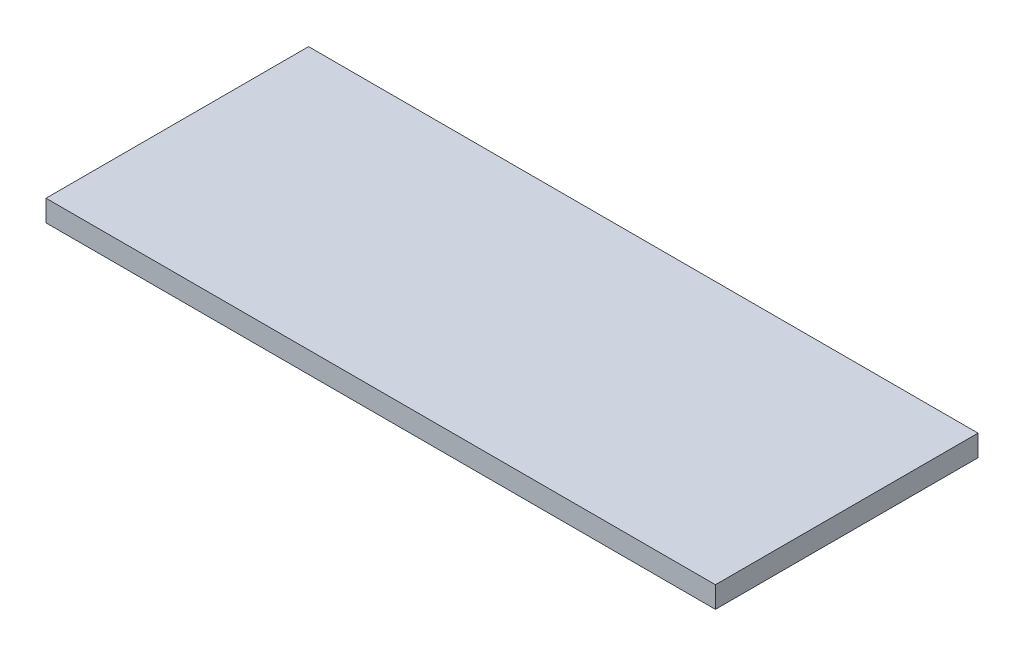
ISO-10303-21;
HEADER;
FILE_DESCRIPTION(('STEP AP214'),'2;1');
FILE_NAME('part.step','',(''),(''),'','','');
FILE_SCHEMA(('AUTOMOTIVE_DESIGN { 1 0 10303 214 1 1 1 1 }'));
ENDSEC;
DATA;
#1=APPLICATION_CONTEXT('core data for automotive mechanical design processes');
#2=APPLICATION_PROTOCOL_DEFINITION('international standard','automotive_design',2000,#1);
#3=PRODUCT_CONTEXT('',#1,'mechanical');
#4=PRODUCT('Part','Part','',(#3));
#5=PRODUCT_RELATED_PRODUCT_CATEGORY('part','',(#4));
#6=PRODUCT_DEFINITION_FORMATION('','',#4);
#7=PRODUCT_DEFINITION_CONTEXT('part definition',#1,'design');
#8=PRODUCT_DEFINITION('design','',#6,#7);
#9=PRODUCT_DEFINITION_SHAPE('','',#8);
#10=(LENGTH_UNIT() NAMED_UNIT(*) SI_UNIT(.MILLI.,.METRE.));
#11=(NAMED_UNIT(*) PLANE_ANGLE_UNIT() SI_UNIT($,.RADIAN.));
#12=(NAMED_UNIT(*) SI_UNIT($,.STERADIAN.) SOLID_ANGLE_UNIT());
#13=UNCERTAINTY_MEASURE_WITH_UNIT(LENGTH_MEASURE(1.E-05),#10,'distance_accuracy_value','');
#14=(GEOMETRIC_REPRESENTATION_CONTEXT(3) GLOBAL_UNCERTAINTY_ASSIGNED_CONTEXT((#13)) GLOBAL_UNIT_ASSIGNED_CONTEXT((#10,
#11,#12)) REPRESENTATION_CONTEXT('',''));
#15=CARTESIAN_POINT('',(0.,0.,0.));
#16=DIRECTION('',(0.,0.,1.));
#17=DIRECTION('',(1.,0.,0.));
#18=AXIS2_PLACEMENT_3D('',#15,#16,#17);
#19=CARTESIAN_POINT('',(-103.32,-116.114624464066,3.));
#20=DIRECTION('',(0.,1.,0.));
#21=DIRECTION('',(-1.,0.,0.));
#22=AXIS2_PLACEMENT_3D('',#19,#20,#21);
#23=PLANE('',#22);
#24=DIRECTION('',(1.,0.,0.));
#25=VECTOR('',#24,1.);
#26=CARTESIAN_POINT('',(-103.18593626287,-116.114624464066,-18.87));
#27=LINE('',#26,#25);
#28=CARTESIAN_POINT('',(-100.32,-116.114624464066,-18.87));
#29=VERTEX_POINT('',#28);
#30=CARTESIAN_POINT('',(-6.31999999999994,-116.114624464066,-18.8699999999962));
#31=VERTEX_POINT('',#30);
#32=EDGE_CURVE('E1691',#29,#31,#27,.T.);
#33=ORIENTED_EDGE('',*,*,#32,.T.);
#34=DIRECTION('',(0.,0.,-1.));
#35=VECTOR('',#34,1.);
#36=CARTESIAN_POINT('',(-6.31999999999994,-116.114624464066,166.13));
#37=LINE('',#36,#35);
#38=CARTESIAN_POINT('',(-6.31999999999994,-116.114624464066,18.));
#39=VERTEX_POINT('',#38);
#40=EDGE_CURVE('E1656',#39,#31,#37,.T.);
#41=ORIENTED_EDGE('',*,*,#40,.F.);
#42=DIRECTION('',(1.,0.,0.));
#43=VECTOR('',#42,1.);
#44=CARTESIAN_POINT('',(-103.32,-116.114624464066,18.));
#45=LINE('',#44,#43);
#46=CARTESIAN_POINT('',(-100.32,-116.114624464066,18.));
#47=VERTEX_POINT('',#46);
#48=EDGE_CURVE('E1696',#47,#39,#45,.T.);
#49=ORIENTED_EDGE('',*,*,#48,.F.);
#50=DIRECTION('',(0.,0.,-1.));
#51=VECTOR('',#50,1.);
#52=CARTESIAN_POINT('',(-100.32,-116.114624464066,136.13));
#53=LINE('',#52,#51);
#54=EDGE_CURVE('E1706',#47,#29,#53,.T.);
#55=ORIENTED_EDGE('',*,*,#54,.T.);
#56=EDGE_LOOP('',(#33,#41,#49,#55));
#57=FACE_BOUND('',#56,.T.);
#58=ADVANCED_FACE('F1642',(#57),#23,.F.);
#59=CARTESIAN_POINT('',(-116.140375406953,22.8853755359338,18.));
#60=DIRECTION('',(0.,0.,-1.));
#61=DIRECTION('',(-1.,0.,0.));
#62=AXIS2_PLACEMENT_3D('',#59,#60,#61);
#63=PLANE('',#62);
#64=ORIENTED_EDGE('',*,*,#48,.T.);
#65=DIRECTION('',(0.,1.,0.));
#66=VECTOR('',#65,1.);
#67=CARTESIAN_POINT('',(-6.31999999999994,22.8853755359338,18.));
#68=LINE('',#67,#66);
#69=CARTESIAN_POINT('',(-6.31999999999994,-113.114624464066,18.));
#70=VERTEX_POINT('',#69);
#71=EDGE_CURVE('E1710',#39,#70,#68,.T.);
#72=ORIENTED_EDGE('',*,*,#71,.T.);
#73=DIRECTION('',(1.,0.,0.));
#74=VECTOR('',#73,1.);
#75=CARTESIAN_POINT('',(-6.31999999999992,-113.114624464066,18.));
#76=LINE('',#75,#74);
#77=CARTESIAN_POINT('',(-100.32,-113.114624464066,18.));
#78=VERTEX_POINT('',#77);
#79=EDGE_CURVE('E1695',#78,#70,#76,.T.);
#80=ORIENTED_EDGE('',*,*,#79,.F.);
#81=DIRECTION('',(0.,-1.,0.));
#82=VECTOR('',#81,1.);
#83=CARTESIAN_POINT('',(-100.32,22.8853755359338,18.));
#84=LINE('',#83,#82);
#85=EDGE_CURVE('E1703',#78,#47,#84,.T.);
#86=ORIENTED_EDGE('',*,*,#85,.T.);
#87=EDGE_LOOP('',(#64,#72,#80,#86));
#88=FACE_BOUND('',#87,.T.);
#89=ADVANCED_FACE('F1713',(#88),#63,.F.);
#90=CARTESIAN_POINT('',(-100.32,-113.114624464066,-63.31));
#91=DIRECTION('',(0.,-1.,0.));
#92=DIRECTION('',(1.,0.,0.));
#93=AXIS2_PLACEMENT_3D('',#90,#91,#92);
#94=PLANE('',#93);
#95=DIRECTION('',(0.,0.,1.));
#96=VECTOR('',#95,1.);
#97=CARTESIAN_POINT('',(-100.320000000002,-113.114624464066,-18.87));
#98=LINE('',#97,#96);
#99=CARTESIAN_POINT('',(-100.32,-113.114624464066,-18.87));
#100=VERTEX_POINT('',#99);
#101=EDGE_CURVE('E13',#100,#78,#98,.T.);
#102=ORIENTED_EDGE('',*,*,#101,.T.);
#103=ORIENTED_EDGE('',*,*,#79,.T.);
#104=DIRECTION('',(0.,0.,1.));
#105=VECTOR('',#104,1.);
#106=CARTESIAN_POINT('',(-6.31999999999748,-113.114624464066,-18.87));
#107=LINE('',#106,#105);
#108=CARTESIAN_POINT('',(-6.31999999999994,-113.114624464066,-18.87));
#109=VERTEX_POINT('',#108);
#110=EDGE_CURVE('E1681',#109,#70,#107,.T.);
#111=ORIENTED_EDGE('',*,*,#110,.F.);
#112=DIRECTION('',(-1.,0.,0.));
#113=VECTOR('',#112,1.);
#114=CARTESIAN_POINT('',(-51.82,-113.114624464066,-18.87));
#115=LINE('',#114,#113);
#116=EDGE_CURVE('E1649',#109,#100,#115,.T.);
#117=ORIENTED_EDGE('',*,*,#116,.T.);
#118=EDGE_LOOP('',(#102,#103,#111,#117));
#119=FACE_BOUND('',#118,.T.);
#120=ADVANCED_FACE('F1693',(#119),#94,.F.);
#121=CARTESIAN_POINT('',(0.,0.,-18.87));
#122=DIRECTION('',(0.,0.,1.));
#123=DIRECTION('',(1.,0.,0.));
#124=AXIS2_PLACEMENT_3D('',#121,#122,#123);
#125=PLANE('',#124);
#126=ORIENTED_EDGE('',*,*,#116,.F.);
#127=DIRECTION('',(0.,1.,0.));
#128=VECTOR('',#127,1.);
#129=CARTESIAN_POINT('',(-6.31999999999994,19.8853755359338,-18.87));
#130=LINE('',#129,#128);
#131=EDGE_CURVE('E1677',#31,#109,#130,.T.);
#132=ORIENTED_EDGE('',*,*,#131,.F.);
#133=ORIENTED_EDGE('',*,*,#32,.F.);
#134=DIRECTION('',(0.,-1.,0.));
#135=VECTOR('',#134,1.);
#136=CARTESIAN_POINT('',(-100.32,19.8853755359338,-18.87));
#137=LINE('',#136,#135);
#138=EDGE_CURVE('E1689',#100,#29,#137,.T.);
#139=ORIENTED_EDGE('',*,*,#138,.F.);
#140=EDGE_LOOP('',(#126,#132,#133,#139));
#141=FACE_BOUND('',#140,.T.);
#142=ADVANCED_FACE('F1688',(#141),#125,.F.);
#143=CARTESIAN_POINT('',(-100.32,19.8853755359338,136.13));
#144=DIRECTION('',(1.,0.,0.));
#145=DIRECTION('',(0.,0.,-1.));
#146=AXIS2_PLACEMENT_3D('',#143,#144,#145);
#147=PLANE('',#146);
#148=ORIENTED_EDGE('',*,*,#101,.F.);
#149=ORIENTED_EDGE('',*,*,#138,.T.);
#150=ORIENTED_EDGE('',*,*,#54,.F.);
#151=ORIENTED_EDGE('',*,*,#85,.F.);
#152=EDGE_LOOP('',(#148,#149,#150,#151));
#153=FACE_BOUND('',#152,.T.);
#154=ADVANCED_FACE('F1716',(#153),#147,.F.);
#155=CARTESIAN_POINT('',(-6.31999999999994,19.8853755359338,166.13));
#156=DIRECTION('',(-1.,0.,0.));
#157=DIRECTION('',(0.,0.,1.));
#158=AXIS2_PLACEMENT_3D('',#155,#156,#157);
#159=PLANE('',#158);
#160=ORIENTED_EDGE('',*,*,#71,.F.);
#161=ORIENTED_EDGE('',*,*,#40,.T.);
#162=ORIENTED_EDGE('',*,*,#131,.T.);
#163=ORIENTED_EDGE('',*,*,#110,.T.);
#164=EDGE_LOOP('',(#160,#161,#162,#163));
#165=FACE_BOUND('',#164,.T.);
#166=ADVANCED_FACE('F1679',(#165),#159,.F.);
#167=CLOSED_SHELL('',(#58,#89,#120,#142,#154,#166));
#168=MANIFOLD_SOLID_BREP('B2',#167);
#169=ADVANCED_BREP_SHAPE_REPRESENTATION('',(#18,#168),#14);
#170=SHAPE_DEFINITION_REPRESENTATION(#9,#169);
ENDSEC;
END-ISO-10303-21;
